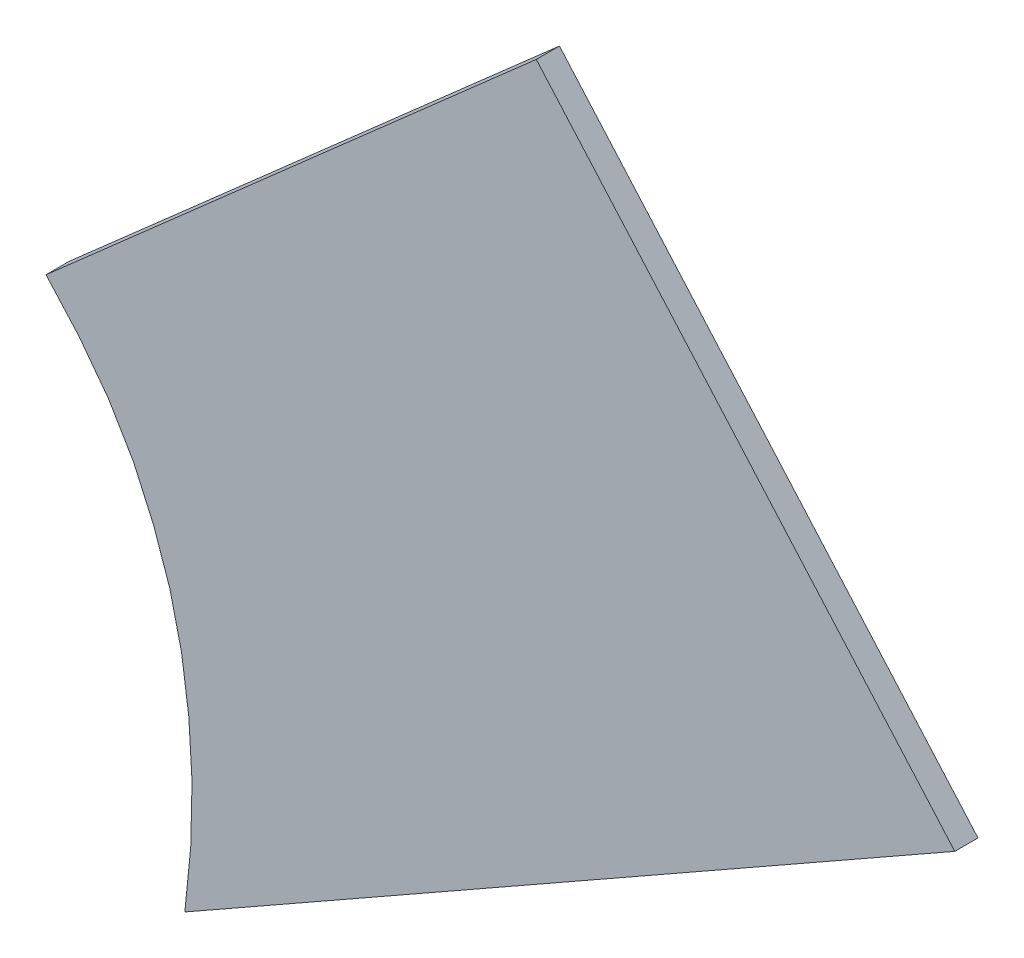
ISO-10303-21;
HEADER;
FILE_DESCRIPTION(('STEP AP214'),'2;1');
FILE_NAME('part.step','',(''),(''),'','','');
FILE_SCHEMA(('AUTOMOTIVE_DESIGN { 1 0 10303 214 1 1 1 1 }'));
ENDSEC;
DATA;
#1=APPLICATION_CONTEXT('core data for automotive mechanical design processes');
#2=APPLICATION_PROTOCOL_DEFINITION('international standard','automotive_design',2000,#1);
#3=PRODUCT_CONTEXT('',#1,'mechanical');
#4=PRODUCT('Part','Part','',(#3));
#5=PRODUCT_RELATED_PRODUCT_CATEGORY('part','',(#4));
#6=PRODUCT_DEFINITION_FORMATION('','',#4);
#7=PRODUCT_DEFINITION_CONTEXT('part definition',#1,'design');
#8=PRODUCT_DEFINITION('design','',#6,#7);
#9=PRODUCT_DEFINITION_SHAPE('','',#8);
#10=(LENGTH_UNIT() NAMED_UNIT(*) SI_UNIT(.MILLI.,.METRE.));
#11=(NAMED_UNIT(*) PLANE_ANGLE_UNIT() SI_UNIT($,.RADIAN.));
#12=(NAMED_UNIT(*) SI_UNIT($,.STERADIAN.) SOLID_ANGLE_UNIT());
#13=UNCERTAINTY_MEASURE_WITH_UNIT(LENGTH_MEASURE(1.E-05),#10,'distance_accuracy_value','');
#14=(GEOMETRIC_REPRESENTATION_CONTEXT(3) GLOBAL_UNCERTAINTY_ASSIGNED_CONTEXT((#13)) GLOBAL_UNIT_ASSIGNED_CONTEXT((#10,
#11,#12)) REPRESENTATION_CONTEXT('',''));
#15=CARTESIAN_POINT('',(0.,0.,0.));
#16=DIRECTION('',(0.,0.,1.));
#17=DIRECTION('',(1.,0.,0.));
#18=AXIS2_PLACEMENT_3D('',#15,#16,#17);
#19=CARTESIAN_POINT('',(44.9440002441406,69.2490005493164,0.));
#20=DIRECTION('',(0.745245226849638,0.666790485728337,0.));
#21=DIRECTION('',(0.666790485728337,-0.745245226849638,0.));
#22=AXIS2_PLACEMENT_3D('',#19,#20,#21);
#23=PLANE('',#22);
#24=DIRECTION('',(0.666790485728337,-0.745245226849638,0.));
#25=VECTOR('',#24,1.);
#26=CARTESIAN_POINT('',(44.9440002441406,69.2490005493164,0.03556));
#27=LINE('',#26,#25);
#28=CARTESIAN_POINT('',(44.9440002441406,69.2490005493164,0.03556));
#29=VERTEX_POINT('',#28);
#30=CARTESIAN_POINT('',(44.9949989318848,69.1920013427734,0.03556));
#31=VERTEX_POINT('',#30);
#32=EDGE_CURVE('E11',#29,#31,#27,.T.);
#33=ORIENTED_EDGE('',*,*,#32,.F.);
#34=DIRECTION('',(0.,0.,1.));
#35=VECTOR('',#34,1.);
#36=CARTESIAN_POINT('',(44.9440002441406,69.2490005493164,0.));
#37=LINE('',#36,#35);
#38=CARTESIAN_POINT('',(44.9440002441406,69.2490005493164,0.));
#39=VERTEX_POINT('',#38);
#40=EDGE_CURVE('E24',#39,#29,#37,.T.);
#41=ORIENTED_EDGE('',*,*,#40,.F.);
#42=DIRECTION('',(0.666790485728337,-0.745245226849638,0.));
#43=VECTOR('',#42,1.);
#44=CARTESIAN_POINT('',(44.9440002441406,69.2490005493164,0.));
#45=LINE('',#44,#43);
#46=CARTESIAN_POINT('',(44.9949989318848,69.1920013427734,0.));
#47=VERTEX_POINT('',#46);
#48=EDGE_CURVE('E130',#39,#47,#45,.T.);
#49=ORIENTED_EDGE('',*,*,#48,.T.);
#50=DIRECTION('',(0.,0.,1.));
#51=VECTOR('',#50,1.);
#52=CARTESIAN_POINT('',(44.9949989318848,69.1920013427734,0.));
#53=LINE('',#52,#51);
#54=EDGE_CURVE('E37',#47,#31,#53,.T.);
#55=ORIENTED_EDGE('',*,*,#54,.T.);
#56=EDGE_LOOP('',(#33,#41,#49,#55));
#57=FACE_BOUND('',#56,.T.);
#58=ADVANCED_FACE('F17',(#57),#23,.F.);
#59=CARTESIAN_POINT('',(44.9949989318848,69.1920013427734,0.));
#60=DIRECTION('',(0.799975585026878,0.600032551917731,0.));
#61=DIRECTION('',(0.600032551917731,-0.799975585026878,0.));
#62=AXIS2_PLACEMENT_3D('',#59,#60,#61);
#63=PLANE('',#62);
#64=DIRECTION('',(0.600032551917731,-0.799975585026878,0.));
#65=VECTOR('',#64,1.);
#66=CARTESIAN_POINT('',(44.9949989318848,69.1920013427734,0.03556));
#67=LINE('',#66,#65);
#68=CARTESIAN_POINT('',(45.0400009155274,69.1320037841797,0.03556));
#69=VERTEX_POINT('',#68);
#70=EDGE_CURVE('E210',#31,#69,#67,.T.);
#71=ORIENTED_EDGE('',*,*,#70,.F.);
#72=ORIENTED_EDGE('',*,*,#54,.F.);
#73=DIRECTION('',(0.600032551917731,-0.799975585026878,0.));
#74=VECTOR('',#73,1.);
#75=CARTESIAN_POINT('',(44.9949989318848,69.1920013427734,0.));
#76=LINE('',#75,#74);
#77=CARTESIAN_POINT('',(45.0400009155274,69.1320037841797,0.));
#78=VERTEX_POINT('',#77);
#79=EDGE_CURVE('E207',#47,#78,#76,.T.);
#80=ORIENTED_EDGE('',*,*,#79,.T.);
#81=DIRECTION('',(0.,0.,1.));
#82=VECTOR('',#81,1.);
#83=CARTESIAN_POINT('',(45.0400009155274,69.1320037841797,0.));
#84=LINE('',#83,#82);
#85=EDGE_CURVE('E205',#78,#69,#84,.T.);
#86=ORIENTED_EDGE('',*,*,#85,.T.);
#87=EDGE_LOOP('',(#71,#72,#80,#86));
#88=FACE_BOUND('',#87,.T.);
#89=ADVANCED_FACE('F218',(#88),#63,.F.);
#90=CARTESIAN_POINT('',(45.0400009155274,69.1320037841797,0.));
#91=DIRECTION('',(0.859875835246505,0.51050323011625,0.));
#92=DIRECTION('',(0.51050323011625,-0.859875835246505,0.));
#93=AXIS2_PLACEMENT_3D('',#90,#91,#92);
#94=PLANE('',#93);
#95=DIRECTION('',(0.51050323011625,-0.859875835246505,0.));
#96=VECTOR('',#95,1.);
#97=CARTESIAN_POINT('',(45.0400009155274,69.1320037841797,0.03556));
#98=LINE('',#97,#96);
#99=CARTESIAN_POINT('',(45.0779991149902,69.068000793457,0.03556));
#100=VERTEX_POINT('',#99);
#101=EDGE_CURVE('E202',#69,#100,#98,.T.);
#102=ORIENTED_EDGE('',*,*,#101,.F.);
#103=ORIENTED_EDGE('',*,*,#85,.F.);
#104=DIRECTION('',(0.51050323011625,-0.859875835246505,0.));
#105=VECTOR('',#104,1.);
#106=CARTESIAN_POINT('',(45.0400009155274,69.1320037841797,0.));
#107=LINE('',#106,#105);
#108=CARTESIAN_POINT('',(45.0779991149902,69.068000793457,0.));
#109=VERTEX_POINT('',#108);
#110=EDGE_CURVE('E199',#78,#109,#107,.T.);
#111=ORIENTED_EDGE('',*,*,#110,.T.);
#112=DIRECTION('',(0.,0.,1.));
#113=VECTOR('',#112,1.);
#114=CARTESIAN_POINT('',(45.0779991149902,69.068000793457,0.));
#115=LINE('',#114,#113);
#116=EDGE_CURVE('E197',#109,#100,#115,.T.);
#117=ORIENTED_EDGE('',*,*,#116,.T.);
#118=EDGE_LOOP('',(#102,#103,#111,#117));
#119=FACE_BOUND('',#118,.T.);
#120=ADVANCED_FACE('F224',(#119),#94,.F.);
#121=CARTESIAN_POINT('',(45.0779991149902,69.068000793457,0.));
#122=DIRECTION('',(0.912159133571591,0.40983620513801,0.));
#123=DIRECTION('',(0.40983620513801,-0.912159133571591,0.));
#124=AXIS2_PLACEMENT_3D('',#121,#122,#123);
#125=PLANE('',#124);
#126=DIRECTION('',(0.40983620513801,-0.912159133571591,0.));
#127=VECTOR('',#126,1.);
#128=CARTESIAN_POINT('',(45.0779991149902,69.068000793457,0.03556));
#129=LINE('',#128,#127);
#130=CARTESIAN_POINT('',(45.109001159668,68.9990005493164,0.03556));
#131=VERTEX_POINT('',#130);
#132=EDGE_CURVE('E194',#100,#131,#129,.T.);
#133=ORIENTED_EDGE('',*,*,#132,.F.);
#134=ORIENTED_EDGE('',*,*,#116,.F.);
#135=DIRECTION('',(0.40983620513801,-0.912159133571591,0.));
#136=VECTOR('',#135,1.);
#137=CARTESIAN_POINT('',(45.0779991149902,69.068000793457,0.));
#138=LINE('',#137,#136);
#139=CARTESIAN_POINT('',(45.109001159668,68.9990005493164,0.));
#140=VERTEX_POINT('',#139);
#141=EDGE_CURVE('E191',#109,#140,#138,.T.);
#142=ORIENTED_EDGE('',*,*,#141,.T.);
#143=DIRECTION('',(0.,0.,1.));
#144=VECTOR('',#143,1.);
#145=CARTESIAN_POINT('',(45.109001159668,68.9990005493164,0.));
#146=LINE('',#145,#144);
#147=EDGE_CURVE('E189',#140,#131,#146,.T.);
#148=ORIENTED_EDGE('',*,*,#147,.T.);
#149=EDGE_LOOP('',(#133,#134,#142,#148));
#150=FACE_BOUND('',#149,.T.);
#151=ADVANCED_FACE('F226',(#150),#125,.F.);
#152=CARTESIAN_POINT('',(45.109001159668,68.9990005493164,0.));
#153=DIRECTION('',(0.944680987838054,0.32799059623306,0.));
#154=DIRECTION('',(0.32799059623306,-0.944680987838054,0.));
#155=AXIS2_PLACEMENT_3D('',#152,#153,#154);
#156=PLANE('',#155);
#157=DIRECTION('',(0.32799059623306,-0.944680987838054,0.));
#158=VECTOR('',#157,1.);
#159=CARTESIAN_POINT('',(45.109001159668,68.9990005493164,0.03556));
#160=LINE('',#159,#158);
#161=CARTESIAN_POINT('',(45.1339988708496,68.927001953125,0.03556));
#162=VERTEX_POINT('',#161);
#163=EDGE_CURVE('E186',#131,#162,#160,.T.);
#164=ORIENTED_EDGE('',*,*,#163,.F.);
#165=ORIENTED_EDGE('',*,*,#147,.F.);
#166=DIRECTION('',(0.32799059623306,-0.944680987838054,0.));
#167=VECTOR('',#166,1.);
#168=CARTESIAN_POINT('',(45.109001159668,68.9990005493164,0.));
#169=LINE('',#168,#167);
#170=CARTESIAN_POINT('',(45.1339988708496,68.927001953125,0.));
#171=VERTEX_POINT('',#170);
#172=EDGE_CURVE('E183',#140,#171,#169,.T.);
#173=ORIENTED_EDGE('',*,*,#172,.T.);
#174=DIRECTION('',(0.,0.,1.));
#175=VECTOR('',#174,1.);
#176=CARTESIAN_POINT('',(45.1339988708496,68.927001953125,0.));
#177=LINE('',#176,#175);
#178=EDGE_CURVE('E181',#171,#162,#177,.T.);
#179=ORIENTED_EDGE('',*,*,#178,.T.);
#180=EDGE_LOOP('',(#164,#165,#173,#179));
#181=FACE_BOUND('',#180,.T.);
#182=ADVANCED_FACE('F231',(#181),#156,.F.);
#183=CARTESIAN_POINT('',(45.1339988708496,68.927001953125,0.));
#184=DIRECTION('',(0.973078558063285,0.230473685781,0.));
#185=DIRECTION('',(0.230473685781,-0.973078558063285,0.));
#186=AXIS2_PLACEMENT_3D('',#183,#184,#185);
#187=PLANE('',#186);
#188=DIRECTION('',(0.230473685781,-0.973078558063285,0.));
#189=VECTOR('',#188,1.);
#190=CARTESIAN_POINT('',(45.1339988708496,68.927001953125,0.03556));
#191=LINE('',#190,#189);
#192=CARTESIAN_POINT('',(45.1520004272461,68.8509979248047,0.03556));
#193=VERTEX_POINT('',#192);
#194=EDGE_CURVE('E178',#162,#193,#191,.T.);
#195=ORIENTED_EDGE('',*,*,#194,.F.);
#196=ORIENTED_EDGE('',*,*,#178,.F.);
#197=DIRECTION('',(0.230473685781,-0.973078558063285,0.));
#198=VECTOR('',#197,1.);
#199=CARTESIAN_POINT('',(45.1339988708496,68.927001953125,0.));
#200=LINE('',#199,#198);
#201=CARTESIAN_POINT('',(45.1520004272461,68.8509979248047,0.));
#202=VERTEX_POINT('',#201);
#203=EDGE_CURVE('E175',#171,#202,#200,.T.);
#204=ORIENTED_EDGE('',*,*,#203,.T.);
#205=DIRECTION('',(0.,0.,1.));
#206=VECTOR('',#205,1.);
#207=CARTESIAN_POINT('',(45.1520004272461,68.8509979248047,0.));
#208=LINE('',#207,#206);
#209=EDGE_CURVE('E173',#202,#193,#208,.T.);
#210=ORIENTED_EDGE('',*,*,#209,.T.);
#211=EDGE_LOOP('',(#195,#196,#204,#210));
#212=FACE_BOUND('',#211,.T.);
#213=ADVANCED_FACE('F234',(#212),#187,.F.);
#214=CARTESIAN_POINT('',(45.1520004272461,68.8509979248047,0.));
#215=DIRECTION('',(0.990447323970001,0.137891618456901,0.));
#216=DIRECTION('',(0.137891618456901,-0.990447323970001,0.));
#217=AXIS2_PLACEMENT_3D('',#214,#215,#216);
#218=PLANE('',#217);
#219=DIRECTION('',(0.137891618456901,-0.990447323970001,0.));
#220=VECTOR('',#219,1.);
#221=CARTESIAN_POINT('',(45.1520004272461,68.8509979248047,0.03556));
#222=LINE('',#221,#220);
#223=CARTESIAN_POINT('',(45.1629981994629,68.7720031738281,0.03556));
#224=VERTEX_POINT('',#223);
#225=EDGE_CURVE('E170',#193,#224,#222,.T.);
#226=ORIENTED_EDGE('',*,*,#225,.F.);
#227=ORIENTED_EDGE('',*,*,#209,.F.);
#228=DIRECTION('',(0.137891618456901,-0.990447323970001,0.));
#229=VECTOR('',#228,1.);
#230=CARTESIAN_POINT('',(45.1520004272461,68.8509979248047,0.));
#231=LINE('',#230,#229);
#232=CARTESIAN_POINT('',(45.1629981994629,68.7720031738281,0.));
#233=VERTEX_POINT('',#232);
#234=EDGE_CURVE('E167',#202,#233,#231,.T.);
#235=ORIENTED_EDGE('',*,*,#234,.T.);
#236=DIRECTION('',(0.,0.,1.));
#237=VECTOR('',#236,1.);
#238=CARTESIAN_POINT('',(45.1629981994629,68.7720031738281,0.));
#239=LINE('',#238,#237);
#240=EDGE_CURVE('E165',#233,#224,#239,.T.);
#241=ORIENTED_EDGE('',*,*,#240,.T.);
#242=EDGE_LOOP('',(#226,#227,#235,#241));
#243=FACE_BOUND('',#242,.T.);
#244=ADVANCED_FACE('F239',(#243),#218,.F.);
#245=CARTESIAN_POINT('',(45.1629981994629,68.7720031738281,0.));
#246=DIRECTION('',(0.99823238340417,0.0594315465323736,0.));
#247=DIRECTION('',(0.0594315465323736,-0.99823238340417,0.));
#248=AXIS2_PLACEMENT_3D('',#245,#246,#247);
#249=PLANE('',#248);
#250=DIRECTION('',(0.0594315465323736,-0.99823238340417,0.));
#251=VECTOR('',#250,1.);
#252=CARTESIAN_POINT('',(45.1629981994629,68.7720031738281,0.03556));
#253=LINE('',#252,#251);
#254=CARTESIAN_POINT('',(45.1679992675781,68.6880035400391,0.03556));
#255=VERTEX_POINT('',#254);
#256=EDGE_CURVE('E162',#224,#255,#253,.T.);
#257=ORIENTED_EDGE('',*,*,#256,.F.);
#258=ORIENTED_EDGE('',*,*,#240,.F.);
#259=DIRECTION('',(0.0594315465323736,-0.99823238340417,0.));
#260=VECTOR('',#259,1.);
#261=CARTESIAN_POINT('',(45.1629981994629,68.7720031738281,0.));
#262=LINE('',#261,#260);
#263=CARTESIAN_POINT('',(45.1679992675781,68.6880035400391,0.));
#264=VERTEX_POINT('',#263);
#265=EDGE_CURVE('E159',#233,#264,#262,.T.);
#266=ORIENTED_EDGE('',*,*,#265,.T.);
#267=DIRECTION('',(0.,0.,1.));
#268=VECTOR('',#267,1.);
#269=CARTESIAN_POINT('',(45.1679992675781,68.6880035400391,0.));
#270=LINE('',#269,#268);
#271=EDGE_CURVE('E157',#264,#255,#270,.T.);
#272=ORIENTED_EDGE('',*,*,#271,.T.);
#273=EDGE_LOOP('',(#257,#258,#266,#272));
#274=FACE_BOUND('',#273,.T.);
#275=ADVANCED_FACE('F242',(#274),#249,.F.);
#276=CARTESIAN_POINT('',(45.1679992675781,68.6880035400391,0.));
#277=DIRECTION('',(0.999742148662266,-0.022707624009494,0.));
#278=DIRECTION('',(-0.022707624009494,-0.999742148662266,0.));
#279=AXIS2_PLACEMENT_3D('',#276,#277,#278);
#280=PLANE('',#279);
#281=DIRECTION('',(-0.022707624009494,-0.999742148662266,0.));
#282=VECTOR('',#281,1.);
#283=CARTESIAN_POINT('',(45.1679992675781,68.6880035400391,0.03556));
#284=LINE('',#283,#282);
#285=CARTESIAN_POINT('',(45.1660003662109,68.5999984741211,0.03556));
#286=VERTEX_POINT('',#285);
#287=EDGE_CURVE('E154',#255,#286,#284,.T.);
#288=ORIENTED_EDGE('',*,*,#287,.F.);
#289=ORIENTED_EDGE('',*,*,#271,.F.);
#290=DIRECTION('',(-0.022707624009494,-0.999742148662266,0.));
#291=VECTOR('',#290,1.);
#292=CARTESIAN_POINT('',(45.1679992675781,68.6880035400391,0.));
#293=LINE('',#292,#291);
#294=CARTESIAN_POINT('',(45.1660003662109,68.5999984741211,0.));
#295=VERTEX_POINT('',#294);
#296=EDGE_CURVE('E151',#264,#295,#293,.T.);
#297=ORIENTED_EDGE('',*,*,#296,.T.);
#298=DIRECTION('',(0.,0.,1.));
#299=VECTOR('',#298,1.);
#300=CARTESIAN_POINT('',(45.1660003662109,68.5999984741211,0.));
#301=LINE('',#300,#299);
#302=EDGE_CURVE('E149',#295,#286,#301,.T.);
#303=ORIENTED_EDGE('',*,*,#302,.T.);
#304=EDGE_LOOP('',(#288,#289,#297,#303));
#305=FACE_BOUND('',#304,.T.);
#306=ADVANCED_FACE('F247',(#305),#280,.F.);
#307=CARTESIAN_POINT('',(45.1660003662109,68.5999984741211,0.));
#308=DIRECTION('',(0.995145638256486,-0.0984132036826968,0.));
#309=DIRECTION('',(-0.0984132036826968,-0.995145638256486,0.));
#310=AXIS2_PLACEMENT_3D('',#307,#308,#309);
#311=PLANE('',#310);
#312=DIRECTION('',(-0.0984132036826968,-0.995145638256485,0.));
#313=VECTOR('',#312,1.);
#314=CARTESIAN_POINT('',(45.1660003662109,68.5999984741211,0.03556));
#315=LINE('',#314,#313);
#316=CARTESIAN_POINT('',(45.1570014953613,68.5090026855469,0.03556));
#317=VERTEX_POINT('',#316);
#318=EDGE_CURVE('E146',#286,#317,#315,.T.);
#319=ORIENTED_EDGE('',*,*,#318,.F.);
#320=ORIENTED_EDGE('',*,*,#302,.F.);
#321=DIRECTION('',(-0.0984132036826968,-0.995145638256485,0.));
#322=VECTOR('',#321,1.);
#323=CARTESIAN_POINT('',(45.1660003662109,68.5999984741211,0.));
#324=LINE('',#323,#322);
#325=CARTESIAN_POINT('',(45.1570014953613,68.5090026855469,0.));
#326=VERTEX_POINT('',#325);
#327=EDGE_CURVE('E143',#295,#326,#324,.T.);
#328=ORIENTED_EDGE('',*,*,#327,.T.);
#329=DIRECTION('',(0.,0.,1.));
#330=VECTOR('',#329,1.);
#331=CARTESIAN_POINT('',(45.1570014953613,68.5090026855469,0.));
#332=LINE('',#331,#330);
#333=EDGE_CURVE('E141',#326,#317,#332,.T.);
#334=ORIENTED_EDGE('',*,*,#333,.T.);
#335=EDGE_LOOP('',(#319,#320,#328,#334));
#336=FACE_BOUND('',#335,.T.);
#337=ADVANCED_FACE('F250',(#336),#311,.F.);
#338=CARTESIAN_POINT('',(45.1570014953613,68.5090026855469,0.));
#339=DIRECTION('',(-0.493995511294244,0.869464452879552,0.));
#340=DIRECTION('',(0.869464452879552,0.493995511294244,0.));
#341=AXIS2_PLACEMENT_3D('',#338,#339,#340);
#342=PLANE('',#341);
#343=DIRECTION('',(0.869464452879552,0.493995511294244,0.));
#344=VECTOR('',#343,1.);
#345=CARTESIAN_POINT('',(45.1570014953613,68.5090026855469,0.03556));
#346=LINE('',#345,#344);
#347=CARTESIAN_POINT('',(46.3380012512207,69.1800003051758,0.03556));
#348=VERTEX_POINT('',#347);
#349=EDGE_CURVE('E138',#317,#348,#346,.T.);
#350=ORIENTED_EDGE('',*,*,#349,.F.);
#351=ORIENTED_EDGE('',*,*,#333,.F.);
#352=DIRECTION('',(0.869464452879552,0.493995511294244,0.));
#353=VECTOR('',#352,1.);
#354=CARTESIAN_POINT('',(45.1570014953613,68.5090026855469,0.));
#355=LINE('',#354,#353);
#356=CARTESIAN_POINT('',(46.3380012512207,69.1800003051758,0.));
#357=VERTEX_POINT('',#356);
#358=EDGE_CURVE('E136',#326,#357,#355,.T.);
#359=ORIENTED_EDGE('',*,*,#358,.T.);
#360=DIRECTION('',(0.,0.,1.));
#361=VECTOR('',#360,1.);
#362=CARTESIAN_POINT('',(46.3380012512207,69.1800003051758,0.));
#363=LINE('',#362,#361);
#364=EDGE_CURVE('E121',#357,#348,#363,.T.);
#365=ORIENTED_EDGE('',*,*,#364,.T.);
#366=EDGE_LOOP('',(#350,#351,#359,#365));
#367=FACE_BOUND('',#366,.T.);
#368=ADVANCED_FACE('F253',(#367),#342,.F.);
#369=CARTESIAN_POINT('',(46.3380012512207,69.1800003051758,0.));
#370=DIRECTION('',(-0.751365826073395,-0.659885895749443,0.));
#371=DIRECTION('',(-0.659885895749443,0.751365826073395,0.));
#372=AXIS2_PLACEMENT_3D('',#369,#370,#371);
#373=PLANE('',#372);
#374=DIRECTION('',(-0.659885895749443,0.751365826073395,0.));
#375=VECTOR('',#374,1.);
#376=CARTESIAN_POINT('',(46.3380012512207,69.1800003051758,0.03556));
#377=LINE('',#376,#375);
#378=CARTESIAN_POINT('',(45.6959991455078,69.911003112793,0.03556));
#379=VERTEX_POINT('',#378);
#380=EDGE_CURVE('E125',#348,#379,#377,.T.);
#381=ORIENTED_EDGE('',*,*,#380,.F.);
#382=ORIENTED_EDGE('',*,*,#364,.F.);
#383=DIRECTION('',(-0.659885895749443,0.751365826073395,0.));
#384=VECTOR('',#383,1.);
#385=CARTESIAN_POINT('',(46.3380012512207,69.1800003051758,0.));
#386=LINE('',#385,#384);
#387=CARTESIAN_POINT('',(45.6959991455078,69.911003112793,0.));
#388=VERTEX_POINT('',#387);
#389=EDGE_CURVE('E117',#357,#388,#386,.T.);
#390=ORIENTED_EDGE('',*,*,#389,.T.);
#391=DIRECTION('',(0.,0.,1.));
#392=VECTOR('',#391,1.);
#393=CARTESIAN_POINT('',(45.6959991455078,69.911003112793,0.));
#394=LINE('',#393,#392);
#395=EDGE_CURVE('E107',#388,#379,#394,.T.);
#396=ORIENTED_EDGE('',*,*,#395,.T.);
#397=EDGE_LOOP('',(#381,#382,#390,#396));
#398=FACE_BOUND('',#397,.T.);
#399=ADVANCED_FACE('F120',(#398),#373,.F.);
#400=CARTESIAN_POINT('',(45.6959991455078,69.911003112793,0.));
#401=DIRECTION('',(0.660764873842062,-0.750592953268603,0.));
#402=DIRECTION('',(-0.750592953268603,-0.660764873842062,0.));
#403=AXIS2_PLACEMENT_3D('',#400,#401,#402);
#404=PLANE('',#403);
#405=DIRECTION('',(-0.750592953268603,-0.660764873842062,0.));
#406=VECTOR('',#405,1.);
#407=CARTESIAN_POINT('',(45.6959991455078,69.911003112793,0.03556));
#408=LINE('',#407,#406);
#409=EDGE_CURVE('E113',#379,#29,#408,.T.);
#410=ORIENTED_EDGE('',*,*,#409,.F.);
#411=ORIENTED_EDGE('',*,*,#395,.F.);
#412=DIRECTION('',(-0.750592953268603,-0.660764873842062,0.));
#413=VECTOR('',#412,1.);
#414=CARTESIAN_POINT('',(45.6959991455078,69.911003112793,0.));
#415=LINE('',#414,#413);
#416=EDGE_CURVE('E111',#388,#39,#415,.T.);
#417=ORIENTED_EDGE('',*,*,#416,.T.);
#418=ORIENTED_EDGE('',*,*,#40,.T.);
#419=EDGE_LOOP('',(#410,#411,#417,#418));
#420=FACE_BOUND('',#419,.T.);
#421=ADVANCED_FACE('F109',(#420),#404,.F.);
#422=CARTESIAN_POINT('',(44.9440002441406,69.2490005493164,0.));
#423=DIRECTION('',(0.,0.,1.));
#424=DIRECTION('',(1.,0.,0.));
#425=AXIS2_PLACEMENT_3D('',#422,#423,#424);
#426=PLANE('',#425);
#427=ORIENTED_EDGE('',*,*,#416,.F.);
#428=ORIENTED_EDGE('',*,*,#389,.F.);
#429=ORIENTED_EDGE('',*,*,#358,.F.);
#430=ORIENTED_EDGE('',*,*,#327,.F.);
#431=ORIENTED_EDGE('',*,*,#296,.F.);
#432=ORIENTED_EDGE('',*,*,#265,.F.);
#433=ORIENTED_EDGE('',*,*,#234,.F.);
#434=ORIENTED_EDGE('',*,*,#203,.F.);
#435=ORIENTED_EDGE('',*,*,#172,.F.);
#436=ORIENTED_EDGE('',*,*,#141,.F.);
#437=ORIENTED_EDGE('',*,*,#110,.F.);
#438=ORIENTED_EDGE('',*,*,#79,.F.);
#439=ORIENTED_EDGE('',*,*,#48,.F.);
#440=EDGE_LOOP('',(#427,#428,#429,#430,#431,#432,#433,#434,#435,#436,#437,#438,#439));
#441=FACE_BOUND('',#440,.T.);
#442=ADVANCED_FACE('F128',(#441),#426,.F.);
#443=CARTESIAN_POINT('',(44.9440002441406,69.2490005493164,0.03556));
#444=DIRECTION('',(0.,0.,1.));
#445=DIRECTION('',(1.,0.,0.));
#446=AXIS2_PLACEMENT_3D('',#443,#444,#445);
#447=PLANE('',#446);
#448=ORIENTED_EDGE('',*,*,#32,.T.);
#449=ORIENTED_EDGE('',*,*,#70,.T.);
#450=ORIENTED_EDGE('',*,*,#101,.T.);
#451=ORIENTED_EDGE('',*,*,#132,.T.);
#452=ORIENTED_EDGE('',*,*,#163,.T.);
#453=ORIENTED_EDGE('',*,*,#194,.T.);
#454=ORIENTED_EDGE('',*,*,#225,.T.);
#455=ORIENTED_EDGE('',*,*,#256,.T.);
#456=ORIENTED_EDGE('',*,*,#287,.T.);
#457=ORIENTED_EDGE('',*,*,#318,.T.);
#458=ORIENTED_EDGE('',*,*,#349,.T.);
#459=ORIENTED_EDGE('',*,*,#380,.T.);
#460=ORIENTED_EDGE('',*,*,#409,.T.);
#461=EDGE_LOOP('',(#448,#449,#450,#451,#452,#453,#454,#455,#456,#457,#458,#459,#460));
#462=FACE_BOUND('',#461,.T.);
#463=ADVANCED_FACE('F221',(#462),#447,.T.);
#464=CLOSED_SHELL('',(#58,#89,#120,#151,#182,#213,#244,#275,#306,#337,#368,#399,#421,#442,#463));
#465=MANIFOLD_SOLID_BREP('B1',#464);
#466=ADVANCED_BREP_SHAPE_REPRESENTATION('',(#18,#465),#14);
#467=SHAPE_DEFINITION_REPRESENTATION(#9,#466);
ENDSEC;
END-ISO-10303-21;
